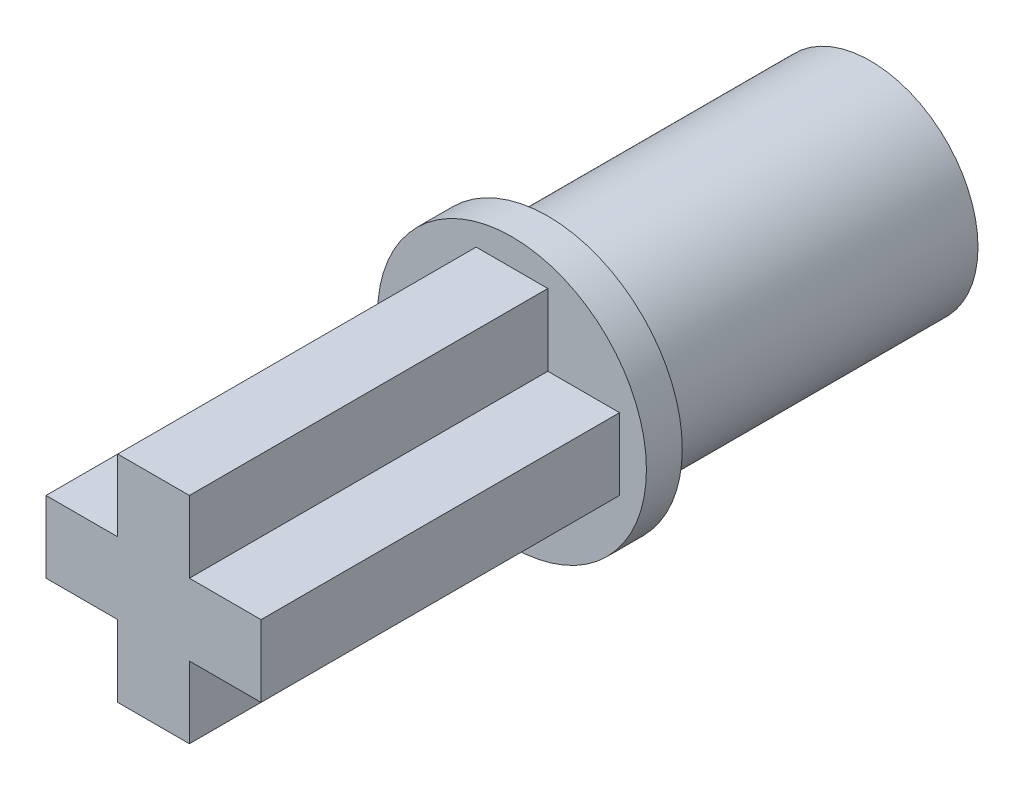
ISO-10303-21;
HEADER;
FILE_DESCRIPTION(('STEP AP214'),'2;1');
FILE_NAME('part.step','',(''),(''),'','','');
FILE_SCHEMA(('AUTOMOTIVE_DESIGN { 1 0 10303 214 1 1 1 1 }'));
ENDSEC;
DATA;
#1=APPLICATION_CONTEXT('core data for automotive mechanical design processes');
#2=APPLICATION_PROTOCOL_DEFINITION('international standard','automotive_design',2000,#1);
#3=PRODUCT_CONTEXT('',#1,'mechanical');
#4=PRODUCT('Part','Part','',(#3));
#5=PRODUCT_RELATED_PRODUCT_CATEGORY('part','',(#4));
#6=PRODUCT_DEFINITION_FORMATION('','',#4);
#7=PRODUCT_DEFINITION_CONTEXT('part definition',#1,'design');
#8=PRODUCT_DEFINITION('design','',#6,#7);
#9=PRODUCT_DEFINITION_SHAPE('','',#8);
#10=(LENGTH_UNIT() NAMED_UNIT(*) SI_UNIT(.MILLI.,.METRE.));
#11=(NAMED_UNIT(*) PLANE_ANGLE_UNIT() SI_UNIT($,.RADIAN.));
#12=(NAMED_UNIT(*) SI_UNIT($,.STERADIAN.) SOLID_ANGLE_UNIT());
#13=UNCERTAINTY_MEASURE_WITH_UNIT(LENGTH_MEASURE(1.E-05),#10,'distance_accuracy_value','');
#14=(GEOMETRIC_REPRESENTATION_CONTEXT(3) GLOBAL_UNCERTAINTY_ASSIGNED_CONTEXT((#13)) GLOBAL_UNIT_ASSIGNED_CONTEXT((#10,
#11,#12)) REPRESENTATION_CONTEXT('',''));
#15=CARTESIAN_POINT('',(0.,0.,0.));
#16=DIRECTION('',(0.,0.,1.));
#17=DIRECTION('',(1.,0.,0.));
#18=AXIS2_PLACEMENT_3D('',#15,#16,#17);
#19=CARTESIAN_POINT('',(0.0354166791251365,-0.345326279525772,8.));
#20=DIRECTION('',(0.,0.,1.));
#21=DIRECTION('',(1.,0.,0.));
#22=AXIS2_PLACEMENT_3D('',#19,#20,#21);
#23=PLANE('',#22);
#24=DIRECTION('',(1.,0.,0.));
#25=VECTOR('',#24,1.);
#26=CARTESIAN_POINT('',(-2.36458332087486,-1.14532627952577,8.));
#27=LINE('',#26,#25);
#28=CARTESIAN_POINT('',(-2.36458332087486,-1.14532627952577,8.));
#29=VERTEX_POINT('',#28);
#30=CARTESIAN_POINT('',(-0.764583320874865,-1.14532627952577,8.));
#31=VERTEX_POINT('',#30);
#32=EDGE_CURVE('E11',#29,#31,#27,.T.);
#33=ORIENTED_EDGE('',*,*,#32,.T.);
#34=DIRECTION('',(0.,-1.,0.));
#35=VECTOR('',#34,1.);
#36=CARTESIAN_POINT('',(-0.764583320874865,-1.14532627952577,8.));
#37=LINE('',#36,#35);
#38=CARTESIAN_POINT('',(-0.764583320874865,-2.74532627952577,8.));
#39=VERTEX_POINT('',#38);
#40=EDGE_CURVE('E42',#31,#39,#37,.T.);
#41=ORIENTED_EDGE('',*,*,#40,.T.);
#42=DIRECTION('',(1.,0.,0.));
#43=VECTOR('',#42,1.);
#44=CARTESIAN_POINT('',(-0.764583320874865,-2.74532627952577,8.));
#45=LINE('',#44,#43);
#46=CARTESIAN_POINT('',(0.835416679125136,-2.74532627952577,8.));
#47=VERTEX_POINT('',#46);
#48=EDGE_CURVE('E156',#39,#47,#45,.T.);
#49=ORIENTED_EDGE('',*,*,#48,.T.);
#50=DIRECTION('',(0.,1.,0.));
#51=VECTOR('',#50,1.);
#52=CARTESIAN_POINT('',(0.835416679125136,-2.74532627952577,8.));
#53=LINE('',#52,#51);
#54=CARTESIAN_POINT('',(0.835416679125136,-1.14532627952577,8.));
#55=VERTEX_POINT('',#54);
#56=EDGE_CURVE('E246',#47,#55,#53,.T.);
#57=ORIENTED_EDGE('',*,*,#56,.T.);
#58=DIRECTION('',(1.,0.,0.));
#59=VECTOR('',#58,1.);
#60=CARTESIAN_POINT('',(0.835416679125136,-1.14532627952577,8.));
#61=LINE('',#60,#59);
#62=CARTESIAN_POINT('',(2.43541667912514,-1.14532627952577,8.));
#63=VERTEX_POINT('',#62);
#64=EDGE_CURVE('E239',#55,#63,#61,.T.);
#65=ORIENTED_EDGE('',*,*,#64,.T.);
#66=DIRECTION('',(0.,1.,0.));
#67=VECTOR('',#66,1.);
#68=CARTESIAN_POINT('',(2.43541667912514,-1.14532627952577,8.));
#69=LINE('',#68,#67);
#70=CARTESIAN_POINT('',(2.43541667912514,0.454673720474228,8.));
#71=VERTEX_POINT('',#70);
#72=EDGE_CURVE('E232',#63,#71,#69,.T.);
#73=ORIENTED_EDGE('',*,*,#72,.T.);
#74=DIRECTION('',(-1.,0.,0.));
#75=VECTOR('',#74,1.);
#76=CARTESIAN_POINT('',(2.43541667912514,0.454673720474228,8.));
#77=LINE('',#76,#75);
#78=CARTESIAN_POINT('',(0.835416679125137,0.454673720474228,8.));
#79=VERTEX_POINT('',#78);
#80=EDGE_CURVE('E225',#71,#79,#77,.T.);
#81=ORIENTED_EDGE('',*,*,#80,.T.);
#82=DIRECTION('',(0.,1.,0.));
#83=VECTOR('',#82,1.);
#84=CARTESIAN_POINT('',(0.835416679125137,0.454673720474228,8.));
#85=LINE('',#84,#83);
#86=CARTESIAN_POINT('',(0.835416679125137,2.05467372047423,8.));
#87=VERTEX_POINT('',#86);
#88=EDGE_CURVE('E221',#79,#87,#85,.T.);
#89=ORIENTED_EDGE('',*,*,#88,.T.);
#90=DIRECTION('',(-1.,0.,0.));
#91=VECTOR('',#90,1.);
#92=CARTESIAN_POINT('',(0.835416679125137,2.05467372047423,8.));
#93=LINE('',#92,#91);
#94=CARTESIAN_POINT('',(-0.764583320874863,2.05467372047423,8.));
#95=VERTEX_POINT('',#94);
#96=EDGE_CURVE('E214',#87,#95,#93,.T.);
#97=ORIENTED_EDGE('',*,*,#96,.T.);
#98=DIRECTION('',(0.,-1.,0.));
#99=VECTOR('',#98,1.);
#100=CARTESIAN_POINT('',(-0.764583320874863,2.05467372047423,8.));
#101=LINE('',#100,#99);
#102=CARTESIAN_POINT('',(-0.764583320874863,0.454673720474228,8.));
#103=VERTEX_POINT('',#102);
#104=EDGE_CURVE('E207',#95,#103,#101,.T.);
#105=ORIENTED_EDGE('',*,*,#104,.T.);
#106=DIRECTION('',(-1.,0.,0.));
#107=VECTOR('',#106,1.);
#108=CARTESIAN_POINT('',(-0.764583320874863,0.454673720474228,8.));
#109=LINE('',#108,#107);
#110=CARTESIAN_POINT('',(-2.36458332087486,0.454673720474228,8.));
#111=VERTEX_POINT('',#110);
#112=EDGE_CURVE('E188',#103,#111,#109,.T.);
#113=ORIENTED_EDGE('',*,*,#112,.T.);
#114=DIRECTION('',(0.,-1.,0.));
#115=VECTOR('',#114,1.);
#116=CARTESIAN_POINT('',(-2.36458332087486,0.454673720474228,8.));
#117=LINE('',#116,#115);
#118=EDGE_CURVE('E189',#111,#29,#117,.T.);
#119=ORIENTED_EDGE('',*,*,#118,.T.);
#120=EDGE_LOOP('',(#33,#41,#49,#57,#65,#73,#81,#89,#97,#105,#113,#119));
#121=FACE_BOUND('',#120,.T.);
#122=ADVANCED_FACE('F17',(#121),#23,.T.);
#123=CARTESIAN_POINT('',(-2.36458332087486,-1.14532627952577,0.));
#124=DIRECTION('',(0.,-1.,0.));
#125=DIRECTION('',(0.,0.,-1.));
#126=AXIS2_PLACEMENT_3D('',#123,#124,#125);
#127=PLANE('',#126);
#128=DIRECTION('',(1.,0.,0.));
#129=VECTOR('',#128,1.);
#130=CARTESIAN_POINT('',(-2.36458332087486,-1.14532627952577,0.));
#131=LINE('',#130,#129);
#132=CARTESIAN_POINT('',(-2.36458332087486,-1.14532627952577,0.));
#133=VERTEX_POINT('',#132);
#134=CARTESIAN_POINT('',(-0.764583320874865,-1.14532627952577,0.));
#135=VERTEX_POINT('',#134);
#136=EDGE_CURVE('E167',#133,#135,#131,.T.);
#137=ORIENTED_EDGE('',*,*,#136,.T.);
#138=DIRECTION('',(0.,0.,1.));
#139=VECTOR('',#138,1.);
#140=CARTESIAN_POINT('',(-0.764583320874865,-1.14532627952577,0.));
#141=LINE('',#140,#139);
#142=EDGE_CURVE('E25',#135,#31,#141,.T.);
#143=ORIENTED_EDGE('',*,*,#142,.T.);
#144=ORIENTED_EDGE('',*,*,#32,.F.);
#145=DIRECTION('',(0.,0.,1.));
#146=VECTOR('',#145,1.);
#147=CARTESIAN_POINT('',(-2.36458332087486,-1.14532627952577,0.));
#148=LINE('',#147,#146);
#149=EDGE_CURVE('E194',#133,#29,#148,.T.);
#150=ORIENTED_EDGE('',*,*,#149,.F.);
#151=EDGE_LOOP('',(#137,#143,#144,#150));
#152=FACE_BOUND('',#151,.T.);
#153=ADVANCED_FACE('F324',(#152),#127,.T.);
#154=CARTESIAN_POINT('',(-0.764583320874865,-1.14532627952577,0.));
#155=DIRECTION('',(-1.,0.,0.));
#156=DIRECTION('',(0.,0.,1.));
#157=AXIS2_PLACEMENT_3D('',#154,#155,#156);
#158=PLANE('',#157);
#159=DIRECTION('',(0.,-1.,0.));
#160=VECTOR('',#159,1.);
#161=CARTESIAN_POINT('',(-0.764583320874865,-1.14532627952577,0.));
#162=LINE('',#161,#160);
#163=CARTESIAN_POINT('',(-0.764583320874865,-2.74532627952577,0.));
#164=VERTEX_POINT('',#163);
#165=EDGE_CURVE('E161',#135,#164,#162,.T.);
#166=ORIENTED_EDGE('',*,*,#165,.T.);
#167=DIRECTION('',(0.,0.,1.));
#168=VECTOR('',#167,1.);
#169=CARTESIAN_POINT('',(-0.764583320874865,-2.74532627952577,0.));
#170=LINE('',#169,#168);
#171=EDGE_CURVE('E149',#164,#39,#170,.T.);
#172=ORIENTED_EDGE('',*,*,#171,.T.);
#173=ORIENTED_EDGE('',*,*,#40,.F.);
#174=ORIENTED_EDGE('',*,*,#142,.F.);
#175=EDGE_LOOP('',(#166,#172,#173,#174));
#176=FACE_BOUND('',#175,.T.);
#177=ADVANCED_FACE('F162',(#176),#158,.T.);
#178=CARTESIAN_POINT('',(-0.764583320874865,-2.74532627952577,0.));
#179=DIRECTION('',(0.,-1.,0.));
#180=DIRECTION('',(0.,0.,-1.));
#181=AXIS2_PLACEMENT_3D('',#178,#179,#180);
#182=PLANE('',#181);
#183=DIRECTION('',(1.,0.,0.));
#184=VECTOR('',#183,1.);
#185=CARTESIAN_POINT('',(-0.764583320874865,-2.74532627952577,0.));
#186=LINE('',#185,#184);
#187=CARTESIAN_POINT('',(0.835416679125136,-2.74532627952577,0.));
#188=VERTEX_POINT('',#187);
#189=EDGE_CURVE('E154',#164,#188,#186,.T.);
#190=ORIENTED_EDGE('',*,*,#189,.T.);
#191=DIRECTION('',(0.,0.,1.));
#192=VECTOR('',#191,1.);
#193=CARTESIAN_POINT('',(0.835416679125136,-2.74532627952577,0.));
#194=LINE('',#193,#192);
#195=EDGE_CURVE('E249',#188,#47,#194,.T.);
#196=ORIENTED_EDGE('',*,*,#195,.T.);
#197=ORIENTED_EDGE('',*,*,#48,.F.);
#198=ORIENTED_EDGE('',*,*,#171,.F.);
#199=EDGE_LOOP('',(#190,#196,#197,#198));
#200=FACE_BOUND('',#199,.T.);
#201=ADVANCED_FACE('F151',(#200),#182,.T.);
#202=CARTESIAN_POINT('',(0.835416679125136,-2.74532627952577,0.));
#203=DIRECTION('',(1.,0.,0.));
#204=DIRECTION('',(0.,-1.,0.));
#205=AXIS2_PLACEMENT_3D('',#202,#203,#204);
#206=PLANE('',#205);
#207=DIRECTION('',(0.,1.,0.));
#208=VECTOR('',#207,1.);
#209=CARTESIAN_POINT('',(0.835416679125136,-2.74532627952577,0.));
#210=LINE('',#209,#208);
#211=CARTESIAN_POINT('',(0.835416679125136,-1.14532627952577,0.));
#212=VERTEX_POINT('',#211);
#213=EDGE_CURVE('E174',#188,#212,#210,.T.);
#214=ORIENTED_EDGE('',*,*,#213,.T.);
#215=DIRECTION('',(0.,0.,1.));
#216=VECTOR('',#215,1.);
#217=CARTESIAN_POINT('',(0.835416679125136,-1.14532627952577,0.));
#218=LINE('',#217,#216);
#219=EDGE_CURVE('E242',#212,#55,#218,.T.);
#220=ORIENTED_EDGE('',*,*,#219,.T.);
#221=ORIENTED_EDGE('',*,*,#56,.F.);
#222=ORIENTED_EDGE('',*,*,#195,.F.);
#223=EDGE_LOOP('',(#214,#220,#221,#222));
#224=FACE_BOUND('',#223,.T.);
#225=ADVANCED_FACE('F353',(#224),#206,.T.);
#226=CARTESIAN_POINT('',(0.835416679125136,-1.14532627952577,0.));
#227=DIRECTION('',(0.,-1.,0.));
#228=DIRECTION('',(-1.,0.,0.));
#229=AXIS2_PLACEMENT_3D('',#226,#227,#228);
#230=PLANE('',#229);
#231=DIRECTION('',(1.,0.,0.));
#232=VECTOR('',#231,1.);
#233=CARTESIAN_POINT('',(0.835416679125136,-1.14532627952577,0.));
#234=LINE('',#233,#232);
#235=CARTESIAN_POINT('',(2.43541667912514,-1.14532627952577,0.));
#236=VERTEX_POINT('',#235);
#237=EDGE_CURVE('E181',#212,#236,#234,.T.);
#238=ORIENTED_EDGE('',*,*,#237,.T.);
#239=DIRECTION('',(0.,0.,1.));
#240=VECTOR('',#239,1.);
#241=CARTESIAN_POINT('',(2.43541667912514,-1.14532627952577,0.));
#242=LINE('',#241,#240);
#243=EDGE_CURVE('E235',#236,#63,#242,.T.);
#244=ORIENTED_EDGE('',*,*,#243,.T.);
#245=ORIENTED_EDGE('',*,*,#64,.F.);
#246=ORIENTED_EDGE('',*,*,#219,.F.);
#247=EDGE_LOOP('',(#238,#244,#245,#246));
#248=FACE_BOUND('',#247,.T.);
#249=ADVANCED_FACE('F351',(#248),#230,.T.);
#250=CARTESIAN_POINT('',(2.43541667912514,-1.14532627952577,0.));
#251=DIRECTION('',(1.,0.,0.));
#252=DIRECTION('',(0.,-1.,0.));
#253=AXIS2_PLACEMENT_3D('',#250,#251,#252);
#254=PLANE('',#253);
#255=DIRECTION('',(0.,1.,0.));
#256=VECTOR('',#255,1.);
#257=CARTESIAN_POINT('',(2.43541667912514,-1.14532627952577,0.));
#258=LINE('',#257,#256);
#259=CARTESIAN_POINT('',(2.43541667912514,0.454673720474228,0.));
#260=VERTEX_POINT('',#259);
#261=EDGE_CURVE('E266',#236,#260,#258,.T.);
#262=ORIENTED_EDGE('',*,*,#261,.T.);
#263=DIRECTION('',(0.,0.,1.));
#264=VECTOR('',#263,1.);
#265=CARTESIAN_POINT('',(2.43541667912514,0.454673720474228,0.));
#266=LINE('',#265,#264);
#267=EDGE_CURVE('E228',#260,#71,#266,.T.);
#268=ORIENTED_EDGE('',*,*,#267,.T.);
#269=ORIENTED_EDGE('',*,*,#72,.F.);
#270=ORIENTED_EDGE('',*,*,#243,.F.);
#271=EDGE_LOOP('',(#262,#268,#269,#270));
#272=FACE_BOUND('',#271,.T.);
#273=ADVANCED_FACE('F348',(#272),#254,.T.);
#274=CARTESIAN_POINT('',(2.43541667912514,0.454673720474228,0.));
#275=DIRECTION('',(0.,1.,0.));
#276=DIRECTION('',(1.,0.,0.));
#277=AXIS2_PLACEMENT_3D('',#274,#275,#276);
#278=PLANE('',#277);
#279=DIRECTION('',(-1.,0.,0.));
#280=VECTOR('',#279,1.);
#281=CARTESIAN_POINT('',(2.43541667912514,0.454673720474228,0.));
#282=LINE('',#281,#280);
#283=CARTESIAN_POINT('',(0.835416679125137,0.454673720474228,0.));
#284=VERTEX_POINT('',#283);
#285=EDGE_CURVE('E262',#260,#284,#282,.T.);
#286=ORIENTED_EDGE('',*,*,#285,.T.);
#287=DIRECTION('',(0.,0.,1.));
#288=VECTOR('',#287,1.);
#289=CARTESIAN_POINT('',(0.835416679125137,0.454673720474228,0.));
#290=LINE('',#289,#288);
#291=EDGE_CURVE('E224',#284,#79,#290,.T.);
#292=ORIENTED_EDGE('',*,*,#291,.T.);
#293=ORIENTED_EDGE('',*,*,#80,.F.);
#294=ORIENTED_EDGE('',*,*,#267,.F.);
#295=EDGE_LOOP('',(#286,#292,#293,#294));
#296=FACE_BOUND('',#295,.T.);
#297=ADVANCED_FACE('F345',(#296),#278,.T.);
#298=CARTESIAN_POINT('',(0.835416679125137,0.454673720474228,0.));
#299=DIRECTION('',(1.,0.,0.));
#300=DIRECTION('',(0.,-1.,0.));
#301=AXIS2_PLACEMENT_3D('',#298,#299,#300);
#302=PLANE('',#301);
#303=DIRECTION('',(0.,1.,0.));
#304=VECTOR('',#303,1.);
#305=CARTESIAN_POINT('',(0.835416679125137,0.454673720474228,0.));
#306=LINE('',#305,#304);
#307=CARTESIAN_POINT('',(0.835416679125137,2.05467372047423,0.));
#308=VERTEX_POINT('',#307);
#309=EDGE_CURVE('E279',#284,#308,#306,.T.);
#310=ORIENTED_EDGE('',*,*,#309,.T.);
#311=DIRECTION('',(0.,0.,1.));
#312=VECTOR('',#311,1.);
#313=CARTESIAN_POINT('',(0.835416679125137,2.05467372047423,0.));
#314=LINE('',#313,#312);
#315=EDGE_CURVE('E217',#308,#87,#314,.T.);
#316=ORIENTED_EDGE('',*,*,#315,.T.);
#317=ORIENTED_EDGE('',*,*,#88,.F.);
#318=ORIENTED_EDGE('',*,*,#291,.F.);
#319=EDGE_LOOP('',(#310,#316,#317,#318));
#320=FACE_BOUND('',#319,.T.);
#321=ADVANCED_FACE('F343',(#320),#302,.T.);
#322=CARTESIAN_POINT('',(0.835416679125137,2.05467372047423,0.));
#323=DIRECTION('',(0.,1.,0.));
#324=DIRECTION('',(1.,0.,0.));
#325=AXIS2_PLACEMENT_3D('',#322,#323,#324);
#326=PLANE('',#325);
#327=DIRECTION('',(-1.,0.,0.));
#328=VECTOR('',#327,1.);
#329=CARTESIAN_POINT('',(0.835416679125137,2.05467372047423,0.));
#330=LINE('',#329,#328);
#331=CARTESIAN_POINT('',(-0.764583320874863,2.05467372047423,0.));
#332=VERTEX_POINT('',#331);
#333=EDGE_CURVE('E284',#308,#332,#330,.T.);
#334=ORIENTED_EDGE('',*,*,#333,.T.);
#335=DIRECTION('',(0.,0.,1.));
#336=VECTOR('',#335,1.);
#337=CARTESIAN_POINT('',(-0.764583320874863,2.05467372047423,0.));
#338=LINE('',#337,#336);
#339=EDGE_CURVE('E210',#332,#95,#338,.T.);
#340=ORIENTED_EDGE('',*,*,#339,.T.);
#341=ORIENTED_EDGE('',*,*,#96,.F.);
#342=ORIENTED_EDGE('',*,*,#315,.F.);
#343=EDGE_LOOP('',(#334,#340,#341,#342));
#344=FACE_BOUND('',#343,.T.);
#345=ADVANCED_FACE('F340',(#344),#326,.T.);
#346=CARTESIAN_POINT('',(-0.764583320874863,2.05467372047423,0.));
#347=DIRECTION('',(-1.,0.,0.));
#348=DIRECTION('',(0.,0.,1.));
#349=AXIS2_PLACEMENT_3D('',#346,#347,#348);
#350=PLANE('',#349);
#351=DIRECTION('',(0.,-1.,0.));
#352=VECTOR('',#351,1.);
#353=CARTESIAN_POINT('',(-0.764583320874863,2.05467372047423,0.));
#354=LINE('',#353,#352);
#355=CARTESIAN_POINT('',(-0.764583320874863,0.454673720474228,0.));
#356=VERTEX_POINT('',#355);
#357=EDGE_CURVE('E288',#332,#356,#354,.T.);
#358=ORIENTED_EDGE('',*,*,#357,.T.);
#359=DIRECTION('',(0.,0.,1.));
#360=VECTOR('',#359,1.);
#361=CARTESIAN_POINT('',(-0.764583320874863,0.454673720474228,0.));
#362=LINE('',#361,#360);
#363=EDGE_CURVE('E201',#356,#103,#362,.T.);
#364=ORIENTED_EDGE('',*,*,#363,.T.);
#365=ORIENTED_EDGE('',*,*,#104,.F.);
#366=ORIENTED_EDGE('',*,*,#339,.F.);
#367=EDGE_LOOP('',(#358,#364,#365,#366));
#368=FACE_BOUND('',#367,.T.);
#369=ADVANCED_FACE('F336',(#368),#350,.T.);
#370=CARTESIAN_POINT('',(-0.764583320874863,0.454673720474228,0.));
#371=DIRECTION('',(0.,1.,0.));
#372=DIRECTION('',(1.,0.,0.));
#373=AXIS2_PLACEMENT_3D('',#370,#371,#372);
#374=PLANE('',#373);
#375=DIRECTION('',(-1.,0.,0.));
#376=VECTOR('',#375,1.);
#377=CARTESIAN_POINT('',(-0.764583320874863,0.454673720474228,0.));
#378=LINE('',#377,#376);
#379=CARTESIAN_POINT('',(-2.36458332087486,0.454673720474228,0.));
#380=VERTEX_POINT('',#379);
#381=EDGE_CURVE('E292',#356,#380,#378,.T.);
#382=ORIENTED_EDGE('',*,*,#381,.T.);
#383=DIRECTION('',(0.,0.,1.));
#384=VECTOR('',#383,1.);
#385=CARTESIAN_POINT('',(-2.36458332087486,0.454673720474228,0.));
#386=LINE('',#385,#384);
#387=EDGE_CURVE('E185',#380,#111,#386,.T.);
#388=ORIENTED_EDGE('',*,*,#387,.T.);
#389=ORIENTED_EDGE('',*,*,#112,.F.);
#390=ORIENTED_EDGE('',*,*,#363,.F.);
#391=EDGE_LOOP('',(#382,#388,#389,#390));
#392=FACE_BOUND('',#391,.T.);
#393=ADVANCED_FACE('F331',(#392),#374,.T.);
#394=CARTESIAN_POINT('',(-2.36458332087486,0.454673720474228,0.));
#395=DIRECTION('',(-1.,0.,0.));
#396=DIRECTION('',(0.,0.,1.));
#397=AXIS2_PLACEMENT_3D('',#394,#395,#396);
#398=PLANE('',#397);
#399=DIRECTION('',(0.,-1.,0.));
#400=VECTOR('',#399,1.);
#401=CARTESIAN_POINT('',(-2.36458332087486,0.454673720474228,0.));
#402=LINE('',#401,#400);
#403=EDGE_CURVE('E300',#380,#133,#402,.T.);
#404=ORIENTED_EDGE('',*,*,#403,.T.);
#405=ORIENTED_EDGE('',*,*,#149,.T.);
#406=ORIENTED_EDGE('',*,*,#118,.F.);
#407=ORIENTED_EDGE('',*,*,#387,.F.);
#408=EDGE_LOOP('',(#404,#405,#406,#407));
#409=FACE_BOUND('',#408,.T.);
#410=ADVANCED_FACE('F327',(#409),#398,.T.);
#411=CARTESIAN_POINT('',(0.0354166791251365,-0.345326279525772,-0.8));
#412=DIRECTION('',(0.,0.,1.));
#413=DIRECTION('',(1.,0.,0.));
#414=AXIS2_PLACEMENT_3D('',#411,#412,#413);
#415=PLANE('',#414);
#416=CARTESIAN_POINT('',(0.0354166791251362,-0.345326279525772,-0.8));
#417=DIRECTION('',(0.,0.,1.));
#418=DIRECTION('',(1.,0.,0.));
#419=AXIS2_PLACEMENT_3D('',#416,#417,#418);
#420=CIRCLE('',#419,2.4);
#421=CARTESIAN_POINT('',(-2.36458332087486,-0.345326279525772,-0.8));
#422=VERTEX_POINT('',#421);
#423=EDGE_CURVE('E301',#422,#422,#420,.T.);
#424=ORIENTED_EDGE('',*,*,#423,.T.);
#425=EDGE_LOOP('',(#424));
#426=FACE_BOUND('',#425,.T.);
#427=CARTESIAN_POINT('',(0.0354166791251362,-0.345326279525772,-0.8));
#428=DIRECTION('',(0.,0.,-1.));
#429=DIRECTION('',(1.,0.,0.));
#430=AXIS2_PLACEMENT_3D('',#427,#428,#429);
#431=CIRCLE('',#430,3.);
#432=CARTESIAN_POINT('',(-2.96458332087486,-0.345326279525772,-0.8));
#433=VERTEX_POINT('',#432);
#434=EDGE_CURVE('E195',#433,#433,#431,.T.);
#435=ORIENTED_EDGE('',*,*,#434,.T.);
#436=EDGE_LOOP('',(#435));
#437=FACE_BOUND('',#436,.T.);
#438=ADVANCED_FACE('F390',(#426,#437),#415,.F.);
#439=CARTESIAN_POINT('',(0.0354166791251362,-0.345326279525772,0.));
#440=DIRECTION('',(0.,0.,-1.));
#441=DIRECTION('',(1.,0.,0.));
#442=AXIS2_PLACEMENT_3D('',#439,#440,#441);
#443=CYLINDRICAL_SURFACE('',#442,3.);
#444=ORIENTED_EDGE('',*,*,#434,.F.);
#445=DIRECTION('',(0.,0.,1.));
#446=VECTOR('',#445,1.);
#447=CARTESIAN_POINT('',(-2.96458332087486,-0.345326279525772,0.));
#448=LINE('',#447,#446);
#449=CARTESIAN_POINT('',(-2.96458332087486,-0.345326279525772,0.));
#450=VERTEX_POINT('',#449);
#451=EDGE_CURVE('E191',#433,#450,#448,.T.);
#452=ORIENTED_EDGE('',*,*,#451,.T.);
#453=CARTESIAN_POINT('',(0.0354166791251362,-0.345326279525772,0.));
#454=DIRECTION('',(0.,0.,1.));
#455=DIRECTION('',(1.,0.,0.));
#456=AXIS2_PLACEMENT_3D('',#453,#454,#455);
#457=CIRCLE('',#456,3.);
#458=EDGE_CURVE('E296',#450,#450,#457,.T.);
#459=ORIENTED_EDGE('',*,*,#458,.F.);
#460=ORIENTED_EDGE('',*,*,#451,.F.);
#461=EDGE_LOOP('',(#444,#452,#459,#460));
#462=FACE_BOUND('',#461,.T.);
#463=ADVANCED_FACE('F396',(#462),#443,.T.);
#464=CARTESIAN_POINT('',(0.0354166791251365,-0.345326279525772,0.));
#465=DIRECTION('',(0.,0.,1.));
#466=DIRECTION('',(1.,0.,0.));
#467=AXIS2_PLACEMENT_3D('',#464,#465,#466);
#468=PLANE('',#467);
#469=ORIENTED_EDGE('',*,*,#403,.F.);
#470=ORIENTED_EDGE('',*,*,#381,.F.);
#471=ORIENTED_EDGE('',*,*,#357,.F.);
#472=ORIENTED_EDGE('',*,*,#333,.F.);
#473=ORIENTED_EDGE('',*,*,#309,.F.);
#474=ORIENTED_EDGE('',*,*,#285,.F.);
#475=ORIENTED_EDGE('',*,*,#261,.F.);
#476=ORIENTED_EDGE('',*,*,#237,.F.);
#477=ORIENTED_EDGE('',*,*,#213,.F.);
#478=ORIENTED_EDGE('',*,*,#189,.F.);
#479=ORIENTED_EDGE('',*,*,#165,.F.);
#480=ORIENTED_EDGE('',*,*,#136,.F.);
#481=EDGE_LOOP('',(#469,#470,#471,#472,#473,#474,#475,#476,#477,#478,#479,#480));
#482=FACE_BOUND('',#481,.T.);
#483=ORIENTED_EDGE('',*,*,#458,.T.);
#484=EDGE_LOOP('',(#483));
#485=FACE_BOUND('',#484,.T.);
#486=ADVANCED_FACE('F170',(#482,#485),#468,.T.);
#487=CARTESIAN_POINT('',(0.0354166791251362,-0.345326279525772,-8.));
#488=DIRECTION('',(0.,0.,-1.));
#489=DIRECTION('',(0.,-1.,0.));
#490=AXIS2_PLACEMENT_3D('',#487,#488,#489);
#491=PLANE('',#490);
#492=CARTESIAN_POINT('',(0.0354166791251362,-0.345326279525772,-8.));
#493=DIRECTION('',(0.,0.,-1.));
#494=DIRECTION('',(1.,0.,0.));
#495=AXIS2_PLACEMENT_3D('',#492,#493,#494);
#496=CIRCLE('',#495,2.4);
#497=CARTESIAN_POINT('',(-2.36458332087486,-0.345326279525772,-8.));
#498=VERTEX_POINT('',#497);
#499=EDGE_CURVE('E314',#498,#498,#496,.T.);
#500=ORIENTED_EDGE('',*,*,#499,.T.);
#501=EDGE_LOOP('',(#500));
#502=FACE_BOUND('',#501,.T.);
#503=ADVANCED_FACE('F402',(#502),#491,.T.);
#504=CARTESIAN_POINT('',(0.0354166791251362,-0.345326279525772,-0.8));
#505=DIRECTION('',(0.,0.,-1.));
#506=DIRECTION('',(1.,0.,0.));
#507=AXIS2_PLACEMENT_3D('',#504,#505,#506);
#508=CYLINDRICAL_SURFACE('',#507,2.4);
#509=ORIENTED_EDGE('',*,*,#499,.F.);
#510=DIRECTION('',(0.,0.,1.));
#511=VECTOR('',#510,1.);
#512=CARTESIAN_POINT('',(-2.36458332087486,-0.345326279525772,-0.8));
#513=LINE('',#512,#511);
#514=EDGE_CURVE('E307',#498,#422,#513,.T.);
#515=ORIENTED_EDGE('',*,*,#514,.T.);
#516=ORIENTED_EDGE('',*,*,#423,.F.);
#517=ORIENTED_EDGE('',*,*,#514,.F.);
#518=EDGE_LOOP('',(#509,#515,#516,#517));
#519=FACE_BOUND('',#518,.T.);
#520=ADVANCED_FACE('F408',(#519),#508,.T.);
#521=CLOSED_SHELL('',(#122,#153,#177,#201,#225,#249,#273,#297,#321,#345,#369,#393,#410,#438,
#463,#486,#503,#520));
#522=MANIFOLD_SOLID_BREP('B1',#521);
#523=ADVANCED_BREP_SHAPE_REPRESENTATION('',(#18,#522),#14);
#524=SHAPE_DEFINITION_REPRESENTATION(#9,#523);
ENDSEC;
END-ISO-10303-21;
